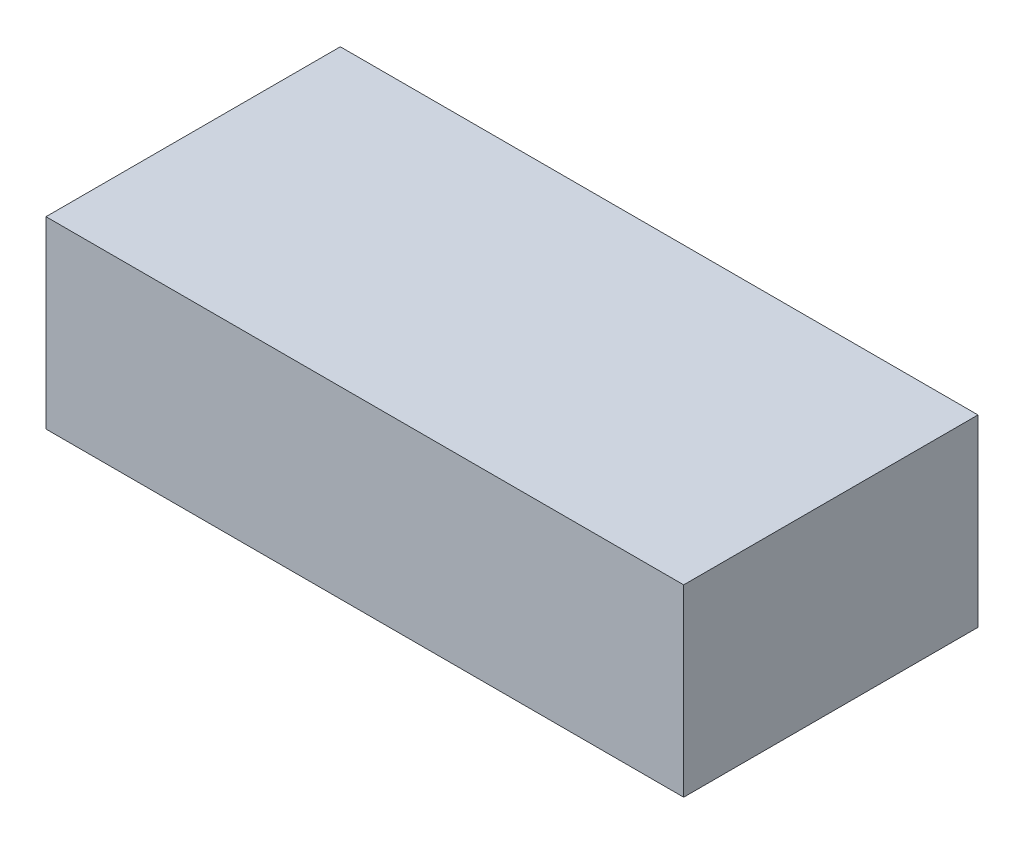
ISO-10303-21;
HEADER;
FILE_DESCRIPTION(('STEP AP214'),'2;1');
FILE_NAME('part.step','',(''),(''),'','','');
FILE_SCHEMA(('AUTOMOTIVE_DESIGN { 1 0 10303 214 1 1 1 1 }'));
ENDSEC;
DATA;
#1=APPLICATION_CONTEXT('core data for automotive mechanical design processes');
#2=APPLICATION_PROTOCOL_DEFINITION('international standard','automotive_design',2000,#1);
#3=PRODUCT_CONTEXT('',#1,'mechanical');
#4=PRODUCT('Part','Part','',(#3));
#5=PRODUCT_RELATED_PRODUCT_CATEGORY('part','',(#4));
#6=PRODUCT_DEFINITION_FORMATION('','',#4);
#7=PRODUCT_DEFINITION_CONTEXT('part definition',#1,'design');
#8=PRODUCT_DEFINITION('design','',#6,#7);
#9=PRODUCT_DEFINITION_SHAPE('','',#8);
#10=(LENGTH_UNIT() NAMED_UNIT(*) SI_UNIT(.MILLI.,.METRE.));
#11=(NAMED_UNIT(*) PLANE_ANGLE_UNIT() SI_UNIT($,.RADIAN.));
#12=(NAMED_UNIT(*) SI_UNIT($,.STERADIAN.) SOLID_ANGLE_UNIT());
#13=UNCERTAINTY_MEASURE_WITH_UNIT(LENGTH_MEASURE(1.E-05),#10,'distance_accuracy_value','');
#14=(GEOMETRIC_REPRESENTATION_CONTEXT(3) GLOBAL_UNCERTAINTY_ASSIGNED_CONTEXT((#13)) GLOBAL_UNIT_ASSIGNED_CONTEXT((#10,
#11,#12)) REPRESENTATION_CONTEXT('',''));
#15=CARTESIAN_POINT('',(0.,0.,0.));
#16=DIRECTION('',(0.,0.,1.));
#17=DIRECTION('',(1.,0.,0.));
#18=AXIS2_PLACEMENT_3D('',#15,#16,#17);
#19=CARTESIAN_POINT('',(26.,15.,12.));
#20=DIRECTION('',(-1.,0.,0.));
#21=DIRECTION('',(0.,0.,1.));
#22=AXIS2_PLACEMENT_3D('',#19,#20,#21);
#23=PLANE('',#22);
#24=DIRECTION('',(0.,0.,-1.));
#25=VECTOR('',#24,1.);
#26=CARTESIAN_POINT('',(26.,0.,12.));
#27=LINE('',#26,#25);
#28=CARTESIAN_POINT('',(26.,0.,12.));
#29=VERTEX_POINT('',#28);
#30=CARTESIAN_POINT('',(26.,0.,-12.));
#31=VERTEX_POINT('',#30);
#32=EDGE_CURVE('E105',#29,#31,#27,.T.);
#33=ORIENTED_EDGE('',*,*,#32,.T.);
#34=DIRECTION('',(0.,-1.,0.));
#35=VECTOR('',#34,1.);
#36=CARTESIAN_POINT('',(26.,15.,-12.));
#37=LINE('',#36,#35);
#38=CARTESIAN_POINT('',(26.,15.,-12.));
#39=VERTEX_POINT('',#38);
#40=EDGE_CURVE('E11',#39,#31,#37,.T.);
#41=ORIENTED_EDGE('',*,*,#40,.F.);
#42=DIRECTION('',(0.,0.,-1.));
#43=VECTOR('',#42,1.);
#44=CARTESIAN_POINT('',(26.,15.,12.));
#45=LINE('',#44,#43);
#46=CARTESIAN_POINT('',(26.,15.,12.));
#47=VERTEX_POINT('',#46);
#48=EDGE_CURVE('E89',#47,#39,#45,.T.);
#49=ORIENTED_EDGE('',*,*,#48,.F.);
#50=DIRECTION('',(0.,-1.,0.));
#51=VECTOR('',#50,1.);
#52=CARTESIAN_POINT('',(26.,15.,12.));
#53=LINE('',#52,#51);
#54=EDGE_CURVE('E97',#47,#29,#53,.T.);
#55=ORIENTED_EDGE('',*,*,#54,.T.);
#56=EDGE_LOOP('',(#33,#41,#49,#55));
#57=FACE_BOUND('',#56,.T.);
#58=ADVANCED_FACE('F39',(#57),#23,.F.);
#59=CARTESIAN_POINT('',(-26.,15.,-12.));
#60=DIRECTION('',(0.,0.,1.));
#61=DIRECTION('',(1.,0.,0.));
#62=AXIS2_PLACEMENT_3D('',#59,#60,#61);
#63=PLANE('',#62);
#64=DIRECTION('',(-1.,0.,0.));
#65=VECTOR('',#64,1.);
#66=CARTESIAN_POINT('',(-26.,0.,-12.));
#67=LINE('',#66,#65);
#68=CARTESIAN_POINT('',(-26.,0.,-12.));
#69=VERTEX_POINT('',#68);
#70=EDGE_CURVE('E92',#31,#69,#67,.T.);
#71=ORIENTED_EDGE('',*,*,#70,.T.);
#72=DIRECTION('',(0.,-1.,0.));
#73=VECTOR('',#72,1.);
#74=CARTESIAN_POINT('',(-26.,15.,-12.));
#75=LINE('',#74,#73);
#76=CARTESIAN_POINT('',(-26.,15.,-12.));
#77=VERTEX_POINT('',#76);
#78=EDGE_CURVE('E50',#77,#69,#75,.T.);
#79=ORIENTED_EDGE('',*,*,#78,.F.);
#80=DIRECTION('',(-1.,0.,0.));
#81=VECTOR('',#80,1.);
#82=CARTESIAN_POINT('',(-26.,15.,-12.));
#83=LINE('',#82,#81);
#84=EDGE_CURVE('E82',#39,#77,#83,.T.);
#85=ORIENTED_EDGE('',*,*,#84,.F.);
#86=ORIENTED_EDGE('',*,*,#40,.T.);
#87=EDGE_LOOP('',(#71,#79,#85,#86));
#88=FACE_BOUND('',#87,.T.);
#89=ADVANCED_FACE('F93',(#88),#63,.F.);
#90=CARTESIAN_POINT('',(-26.,15.,12.));
#91=DIRECTION('',(1.,0.,0.));
#92=DIRECTION('',(0.,0.,-1.));
#93=AXIS2_PLACEMENT_3D('',#90,#91,#92);
#94=PLANE('',#93);
#95=DIRECTION('',(0.,0.,1.));
#96=VECTOR('',#95,1.);
#97=CARTESIAN_POINT('',(-26.,0.,12.));
#98=LINE('',#97,#96);
#99=CARTESIAN_POINT('',(-26.,0.,12.));
#100=VERTEX_POINT('',#99);
#101=EDGE_CURVE('E72',#69,#100,#98,.T.);
#102=ORIENTED_EDGE('',*,*,#101,.T.);
#103=DIRECTION('',(0.,-1.,0.));
#104=VECTOR('',#103,1.);
#105=CARTESIAN_POINT('',(-26.,15.,12.));
#106=LINE('',#105,#104);
#107=CARTESIAN_POINT('',(-26.,15.,12.));
#108=VERTEX_POINT('',#107);
#109=EDGE_CURVE('E94',#108,#100,#106,.T.);
#110=ORIENTED_EDGE('',*,*,#109,.F.);
#111=DIRECTION('',(0.,0.,1.));
#112=VECTOR('',#111,1.);
#113=CARTESIAN_POINT('',(-26.,15.,12.));
#114=LINE('',#113,#112);
#115=EDGE_CURVE('E88',#77,#108,#114,.T.);
#116=ORIENTED_EDGE('',*,*,#115,.F.);
#117=ORIENTED_EDGE('',*,*,#78,.T.);
#118=EDGE_LOOP('',(#102,#110,#116,#117));
#119=FACE_BOUND('',#118,.T.);
#120=ADVANCED_FACE('F96',(#119),#94,.F.);
#121=CARTESIAN_POINT('',(-26.,15.,12.));
#122=DIRECTION('',(0.,0.,-1.));
#123=DIRECTION('',(-1.,0.,0.));
#124=AXIS2_PLACEMENT_3D('',#121,#122,#123);
#125=PLANE('',#124);
#126=DIRECTION('',(1.,0.,0.));
#127=VECTOR('',#126,1.);
#128=CARTESIAN_POINT('',(-26.,0.,12.));
#129=LINE('',#128,#127);
#130=EDGE_CURVE('E76',#100,#29,#129,.T.);
#131=ORIENTED_EDGE('',*,*,#130,.T.);
#132=ORIENTED_EDGE('',*,*,#54,.F.);
#133=DIRECTION('',(1.,0.,0.));
#134=VECTOR('',#133,1.);
#135=CARTESIAN_POINT('',(-26.,15.,12.));
#136=LINE('',#135,#134);
#137=EDGE_CURVE('E54',#108,#47,#136,.T.);
#138=ORIENTED_EDGE('',*,*,#137,.F.);
#139=ORIENTED_EDGE('',*,*,#109,.T.);
#140=EDGE_LOOP('',(#131,#132,#138,#139));
#141=FACE_BOUND('',#140,.T.);
#142=ADVANCED_FACE('F108',(#141),#125,.F.);
#143=CARTESIAN_POINT('',(0.,15.,0.));
#144=DIRECTION('',(0.,-1.,0.));
#145=DIRECTION('',(0.,0.,-1.));
#146=AXIS2_PLACEMENT_3D('',#143,#144,#145);
#147=PLANE('',#146);
#148=ORIENTED_EDGE('',*,*,#48,.T.);
#149=ORIENTED_EDGE('',*,*,#84,.T.);
#150=ORIENTED_EDGE('',*,*,#115,.T.);
#151=ORIENTED_EDGE('',*,*,#137,.T.);
#152=EDGE_LOOP('',(#148,#149,#150,#151));
#153=FACE_BOUND('',#152,.T.);
#154=ADVANCED_FACE('F86',(#153),#147,.F.);
#155=CARTESIAN_POINT('',(0.,0.,0.));
#156=DIRECTION('',(0.,-1.,0.));
#157=DIRECTION('',(0.,0.,-1.));
#158=AXIS2_PLACEMENT_3D('',#155,#156,#157);
#159=PLANE('',#158);
#160=ORIENTED_EDGE('',*,*,#32,.F.);
#161=ORIENTED_EDGE('',*,*,#130,.F.);
#162=ORIENTED_EDGE('',*,*,#101,.F.);
#163=ORIENTED_EDGE('',*,*,#70,.F.);
#164=EDGE_LOOP('',(#160,#161,#162,#163));
#165=FACE_BOUND('',#164,.T.);
#166=ADVANCED_FACE('F115',(#165),#159,.T.);
#167=CLOSED_SHELL('',(#58,#89,#120,#142,#154,#166));
#168=MANIFOLD_SOLID_BREP('B2',#167);
#169=ADVANCED_BREP_SHAPE_REPRESENTATION('',(#18,#168),#14);
#170=SHAPE_DEFINITION_REPRESENTATION(#9,#169);
ENDSEC;
END-ISO-10303-21;
